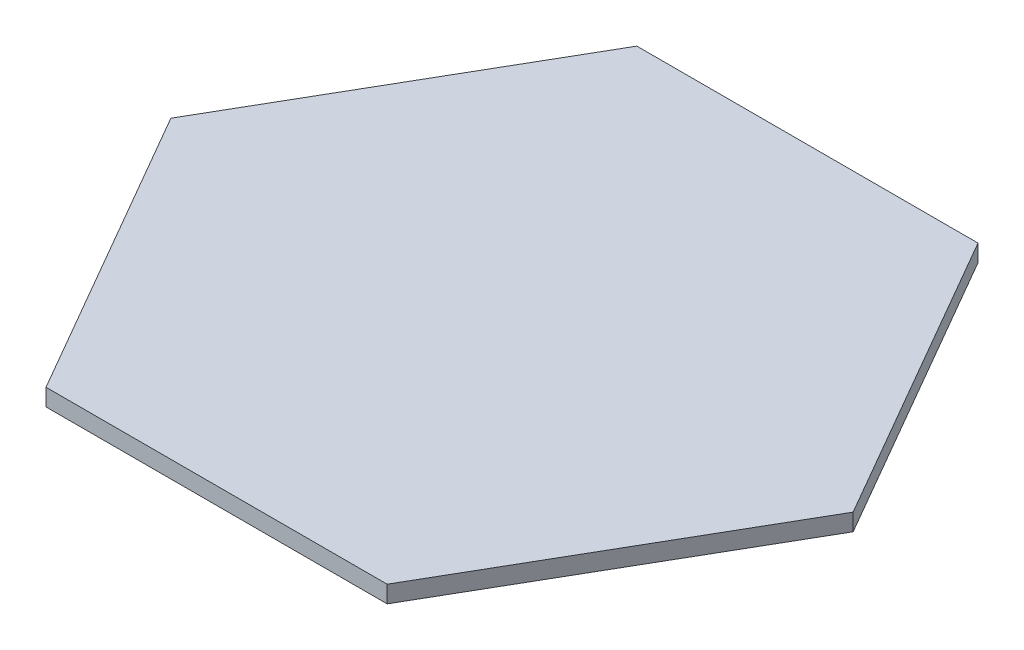
ISO-10303-21;
HEADER;
FILE_DESCRIPTION(('STEP AP214'),'2;1');
FILE_NAME('part.step','',(''),(''),'','','');
FILE_SCHEMA(('AUTOMOTIVE_DESIGN { 1 0 10303 214 1 1 1 1 }'));
ENDSEC;
DATA;
#1=APPLICATION_CONTEXT('core data for automotive mechanical design processes');
#2=APPLICATION_PROTOCOL_DEFINITION('international standard','automotive_design',2000,#1);
#3=PRODUCT_CONTEXT('',#1,'mechanical');
#4=PRODUCT('Part','Part','',(#3));
#5=PRODUCT_RELATED_PRODUCT_CATEGORY('part','',(#4));
#6=PRODUCT_DEFINITION_FORMATION('','',#4);
#7=PRODUCT_DEFINITION_CONTEXT('part definition',#1,'design');
#8=PRODUCT_DEFINITION('design','',#6,#7);
#9=PRODUCT_DEFINITION_SHAPE('','',#8);
#10=(LENGTH_UNIT() NAMED_UNIT(*) SI_UNIT(.MILLI.,.METRE.));
#11=(NAMED_UNIT(*) PLANE_ANGLE_UNIT() SI_UNIT($,.RADIAN.));
#12=(NAMED_UNIT(*) SI_UNIT($,.STERADIAN.) SOLID_ANGLE_UNIT());
#13=UNCERTAINTY_MEASURE_WITH_UNIT(LENGTH_MEASURE(1.E-05),#10,'distance_accuracy_value','');
#14=(GEOMETRIC_REPRESENTATION_CONTEXT(3) GLOBAL_UNCERTAINTY_ASSIGNED_CONTEXT((#13)) GLOBAL_UNIT_ASSIGNED_CONTEXT((#10,
#11,#12)) REPRESENTATION_CONTEXT('',''));
#15=CARTESIAN_POINT('',(0.,0.,0.));
#16=DIRECTION('',(0.,0.,1.));
#17=DIRECTION('',(1.,0.,0.));
#18=AXIS2_PLACEMENT_3D('',#15,#16,#17);
#19=CARTESIAN_POINT('',(-9.99999999999999,1.,-17.3205080756888));
#20=DIRECTION('',(0.866025403784439,0.,0.5));
#21=DIRECTION('',(0.5,0.,-0.866025403784439));
#22=AXIS2_PLACEMENT_3D('',#19,#20,#21);
#23=PLANE('',#22);
#24=DIRECTION('',(-0.5,0.,0.866025403784439));
#25=VECTOR('',#24,1.);
#26=CARTESIAN_POINT('',(-9.99999999999999,0.,-17.3205080756888));
#27=LINE('',#26,#25);
#28=CARTESIAN_POINT('',(-9.99999999999999,0.,-17.3205080756888));
#29=VERTEX_POINT('',#28);
#30=CARTESIAN_POINT('',(-20.,0.,0.));
#31=VERTEX_POINT('',#30);
#32=EDGE_CURVE('E117',#29,#31,#27,.T.);
#33=ORIENTED_EDGE('',*,*,#32,.T.);
#34=DIRECTION('',(0.,-1.,0.));
#35=VECTOR('',#34,1.);
#36=CARTESIAN_POINT('',(-20.,1.,0.));
#37=LINE('',#36,#35);
#38=CARTESIAN_POINT('',(-20.,1.,0.));
#39=VERTEX_POINT('',#38);
#40=EDGE_CURVE('E11',#39,#31,#37,.T.);
#41=ORIENTED_EDGE('',*,*,#40,.F.);
#42=DIRECTION('',(-0.5,0.,0.866025403784439));
#43=VECTOR('',#42,1.);
#44=CARTESIAN_POINT('',(-9.99999999999999,1.,-17.3205080756888));
#45=LINE('',#44,#43);
#46=CARTESIAN_POINT('',(-9.99999999999999,1.,-17.3205080756888));
#47=VERTEX_POINT('',#46);
#48=EDGE_CURVE('E127',#47,#39,#45,.T.);
#49=ORIENTED_EDGE('',*,*,#48,.F.);
#50=DIRECTION('',(0.,-1.,0.));
#51=VECTOR('',#50,1.);
#52=CARTESIAN_POINT('',(-9.99999999999999,1.,-17.3205080756888));
#53=LINE('',#52,#51);
#54=EDGE_CURVE('E113',#47,#29,#53,.T.);
#55=ORIENTED_EDGE('',*,*,#54,.T.);
#56=EDGE_LOOP('',(#33,#41,#49,#55));
#57=FACE_BOUND('',#56,.T.);
#58=ADVANCED_FACE('F33',(#57),#23,.F.);
#59=CARTESIAN_POINT('',(-20.,1.,0.));
#60=DIRECTION('',(0.866025403784439,0.,-0.5));
#61=DIRECTION('',(-0.5,0.,-0.866025403784439));
#62=AXIS2_PLACEMENT_3D('',#59,#60,#61);
#63=PLANE('',#62);
#64=DIRECTION('',(0.5,0.,0.866025403784439));
#65=VECTOR('',#64,1.);
#66=CARTESIAN_POINT('',(-20.,0.,0.));
#67=LINE('',#66,#65);
#68=CARTESIAN_POINT('',(-10.,0.,17.3205080756888));
#69=VERTEX_POINT('',#68);
#70=EDGE_CURVE('E120',#31,#69,#67,.T.);
#71=ORIENTED_EDGE('',*,*,#70,.T.);
#72=DIRECTION('',(0.,-1.,0.));
#73=VECTOR('',#72,1.);
#74=CARTESIAN_POINT('',(-10.,1.,17.3205080756888));
#75=LINE('',#74,#73);
#76=CARTESIAN_POINT('',(-10.,1.,17.3205080756888));
#77=VERTEX_POINT('',#76);
#78=EDGE_CURVE('E41',#77,#69,#75,.T.);
#79=ORIENTED_EDGE('',*,*,#78,.F.);
#80=DIRECTION('',(0.5,0.,0.866025403784439));
#81=VECTOR('',#80,1.);
#82=CARTESIAN_POINT('',(-20.,1.,0.));
#83=LINE('',#82,#81);
#84=EDGE_CURVE('E86',#39,#77,#83,.T.);
#85=ORIENTED_EDGE('',*,*,#84,.F.);
#86=ORIENTED_EDGE('',*,*,#40,.T.);
#87=EDGE_LOOP('',(#71,#79,#85,#86));
#88=FACE_BOUND('',#87,.T.);
#89=ADVANCED_FACE('F151',(#88),#63,.F.);
#90=CARTESIAN_POINT('',(-10.,1.,17.3205080756888));
#91=DIRECTION('',(0.,0.,-1.));
#92=DIRECTION('',(-1.,0.,0.));
#93=AXIS2_PLACEMENT_3D('',#90,#91,#92);
#94=PLANE('',#93);
#95=DIRECTION('',(1.,0.,0.));
#96=VECTOR('',#95,1.);
#97=CARTESIAN_POINT('',(-10.,0.,17.3205080756888));
#98=LINE('',#97,#96);
#99=CARTESIAN_POINT('',(10.,0.,17.3205080756888));
#100=VERTEX_POINT('',#99);
#101=EDGE_CURVE('E122',#69,#100,#98,.T.);
#102=ORIENTED_EDGE('',*,*,#101,.T.);
#103=DIRECTION('',(0.,-1.,0.));
#104=VECTOR('',#103,1.);
#105=CARTESIAN_POINT('',(10.,1.,17.3205080756888));
#106=LINE('',#105,#104);
#107=CARTESIAN_POINT('',(10.,1.,17.3205080756888));
#108=VERTEX_POINT('',#107);
#109=EDGE_CURVE('E108',#108,#100,#106,.T.);
#110=ORIENTED_EDGE('',*,*,#109,.F.);
#111=DIRECTION('',(1.,0.,0.));
#112=VECTOR('',#111,1.);
#113=CARTESIAN_POINT('',(-10.,1.,17.3205080756888));
#114=LINE('',#113,#112);
#115=EDGE_CURVE('E99',#77,#108,#114,.T.);
#116=ORIENTED_EDGE('',*,*,#115,.F.);
#117=ORIENTED_EDGE('',*,*,#78,.T.);
#118=EDGE_LOOP('',(#102,#110,#116,#117));
#119=FACE_BOUND('',#118,.T.);
#120=ADVANCED_FACE('F133',(#119),#94,.F.);
#121=CARTESIAN_POINT('',(10.,1.,17.3205080756888));
#122=DIRECTION('',(-0.866025403784439,0.,-0.5));
#123=DIRECTION('',(-0.5,0.,0.866025403784439));
#124=AXIS2_PLACEMENT_3D('',#121,#122,#123);
#125=PLANE('',#124);
#126=DIRECTION('',(0.5,0.,-0.866025403784439));
#127=VECTOR('',#126,1.);
#128=CARTESIAN_POINT('',(10.,0.,17.3205080756888));
#129=LINE('',#128,#127);
#130=CARTESIAN_POINT('',(20.,0.,0.));
#131=VERTEX_POINT('',#130);
#132=EDGE_CURVE('E107',#100,#131,#129,.T.);
#133=ORIENTED_EDGE('',*,*,#132,.T.);
#134=DIRECTION('',(0.,-1.,0.));
#135=VECTOR('',#134,1.);
#136=CARTESIAN_POINT('',(20.,1.,0.));
#137=LINE('',#136,#135);
#138=CARTESIAN_POINT('',(20.,1.,0.));
#139=VERTEX_POINT('',#138);
#140=EDGE_CURVE('E104',#139,#131,#137,.T.);
#141=ORIENTED_EDGE('',*,*,#140,.F.);
#142=DIRECTION('',(0.5,0.,-0.866025403784439));
#143=VECTOR('',#142,1.);
#144=CARTESIAN_POINT('',(10.,1.,17.3205080756888));
#145=LINE('',#144,#143);
#146=EDGE_CURVE('E93',#108,#139,#145,.T.);
#147=ORIENTED_EDGE('',*,*,#146,.F.);
#148=ORIENTED_EDGE('',*,*,#109,.T.);
#149=EDGE_LOOP('',(#133,#141,#147,#148));
#150=FACE_BOUND('',#149,.T.);
#151=ADVANCED_FACE('F105',(#150),#125,.F.);
#152=CARTESIAN_POINT('',(20.,1.,0.));
#153=DIRECTION('',(-0.866025403784439,0.,0.5));
#154=DIRECTION('',(0.5,0.,0.866025403784439));
#155=AXIS2_PLACEMENT_3D('',#152,#153,#154);
#156=PLANE('',#155);
#157=DIRECTION('',(-0.5,0.,-0.866025403784439));
#158=VECTOR('',#157,1.);
#159=CARTESIAN_POINT('',(20.,0.,0.));
#160=LINE('',#159,#158);
#161=CARTESIAN_POINT('',(9.99999999999999,0.,-17.3205080756888));
#162=VERTEX_POINT('',#161);
#163=EDGE_CURVE('E72',#131,#162,#160,.T.);
#164=ORIENTED_EDGE('',*,*,#163,.T.);
#165=DIRECTION('',(0.,-1.,0.));
#166=VECTOR('',#165,1.);
#167=CARTESIAN_POINT('',(9.99999999999999,1.,-17.3205080756888));
#168=LINE('',#167,#166);
#169=CARTESIAN_POINT('',(9.99999999999999,1.,-17.3205080756888));
#170=VERTEX_POINT('',#169);
#171=EDGE_CURVE('E109',#170,#162,#168,.T.);
#172=ORIENTED_EDGE('',*,*,#171,.F.);
#173=DIRECTION('',(-0.5,0.,-0.866025403784439));
#174=VECTOR('',#173,1.);
#175=CARTESIAN_POINT('',(20.,1.,0.));
#176=LINE('',#175,#174);
#177=EDGE_CURVE('E97',#139,#170,#176,.T.);
#178=ORIENTED_EDGE('',*,*,#177,.F.);
#179=ORIENTED_EDGE('',*,*,#140,.T.);
#180=EDGE_LOOP('',(#164,#172,#178,#179));
#181=FACE_BOUND('',#180,.T.);
#182=ADVANCED_FACE('F111',(#181),#156,.F.);
#183=CARTESIAN_POINT('',(9.99999999999999,1.,-17.3205080756888));
#184=DIRECTION('',(0.,0.,1.));
#185=DIRECTION('',(1.,0.,0.));
#186=AXIS2_PLACEMENT_3D('',#183,#184,#185);
#187=PLANE('',#186);
#188=DIRECTION('',(-1.,0.,0.));
#189=VECTOR('',#188,1.);
#190=CARTESIAN_POINT('',(9.99999999999999,0.,-17.3205080756888));
#191=LINE('',#190,#189);
#192=EDGE_CURVE('E78',#162,#29,#191,.T.);
#193=ORIENTED_EDGE('',*,*,#192,.T.);
#194=ORIENTED_EDGE('',*,*,#54,.F.);
#195=DIRECTION('',(-1.,0.,0.));
#196=VECTOR('',#195,1.);
#197=CARTESIAN_POINT('',(9.99999999999999,1.,-17.3205080756888));
#198=LINE('',#197,#196);
#199=EDGE_CURVE('E49',#170,#47,#198,.T.);
#200=ORIENTED_EDGE('',*,*,#199,.F.);
#201=ORIENTED_EDGE('',*,*,#171,.T.);
#202=EDGE_LOOP('',(#193,#194,#200,#201));
#203=FACE_BOUND('',#202,.T.);
#204=ADVANCED_FACE('F140',(#203),#187,.F.);
#205=CARTESIAN_POINT('',(0.,1.,0.));
#206=DIRECTION('',(0.,1.,0.));
#207=DIRECTION('',(0.,0.,1.));
#208=AXIS2_PLACEMENT_3D('',#205,#206,#207);
#209=PLANE('',#208);
#210=ORIENTED_EDGE('',*,*,#48,.T.);
#211=ORIENTED_EDGE('',*,*,#84,.T.);
#212=ORIENTED_EDGE('',*,*,#115,.T.);
#213=ORIENTED_EDGE('',*,*,#146,.T.);
#214=ORIENTED_EDGE('',*,*,#177,.T.);
#215=ORIENTED_EDGE('',*,*,#199,.T.);
#216=EDGE_LOOP('',(#210,#211,#212,#213,#214,#215));
#217=FACE_BOUND('',#216,.T.);
#218=ADVANCED_FACE('F95',(#217),#209,.T.);
#219=CARTESIAN_POINT('',(0.,0.,0.));
#220=DIRECTION('',(0.,1.,0.));
#221=DIRECTION('',(0.,0.,1.));
#222=AXIS2_PLACEMENT_3D('',#219,#220,#221);
#223=PLANE('',#222);
#224=ORIENTED_EDGE('',*,*,#32,.F.);
#225=ORIENTED_EDGE('',*,*,#192,.F.);
#226=ORIENTED_EDGE('',*,*,#163,.F.);
#227=ORIENTED_EDGE('',*,*,#132,.F.);
#228=ORIENTED_EDGE('',*,*,#101,.F.);
#229=ORIENTED_EDGE('',*,*,#70,.F.);
#230=EDGE_LOOP('',(#224,#225,#226,#227,#228,#229));
#231=FACE_BOUND('',#230,.T.);
#232=ADVANCED_FACE('F136',(#231),#223,.F.);
#233=CLOSED_SHELL('',(#58,#89,#120,#151,#182,#204,#218,#232));
#234=MANIFOLD_SOLID_BREP('B2',#233);
#235=ADVANCED_BREP_SHAPE_REPRESENTATION('',(#18,#234),#14);
#236=SHAPE_DEFINITION_REPRESENTATION(#9,#235);
ENDSEC;
END-ISO-10303-21;
